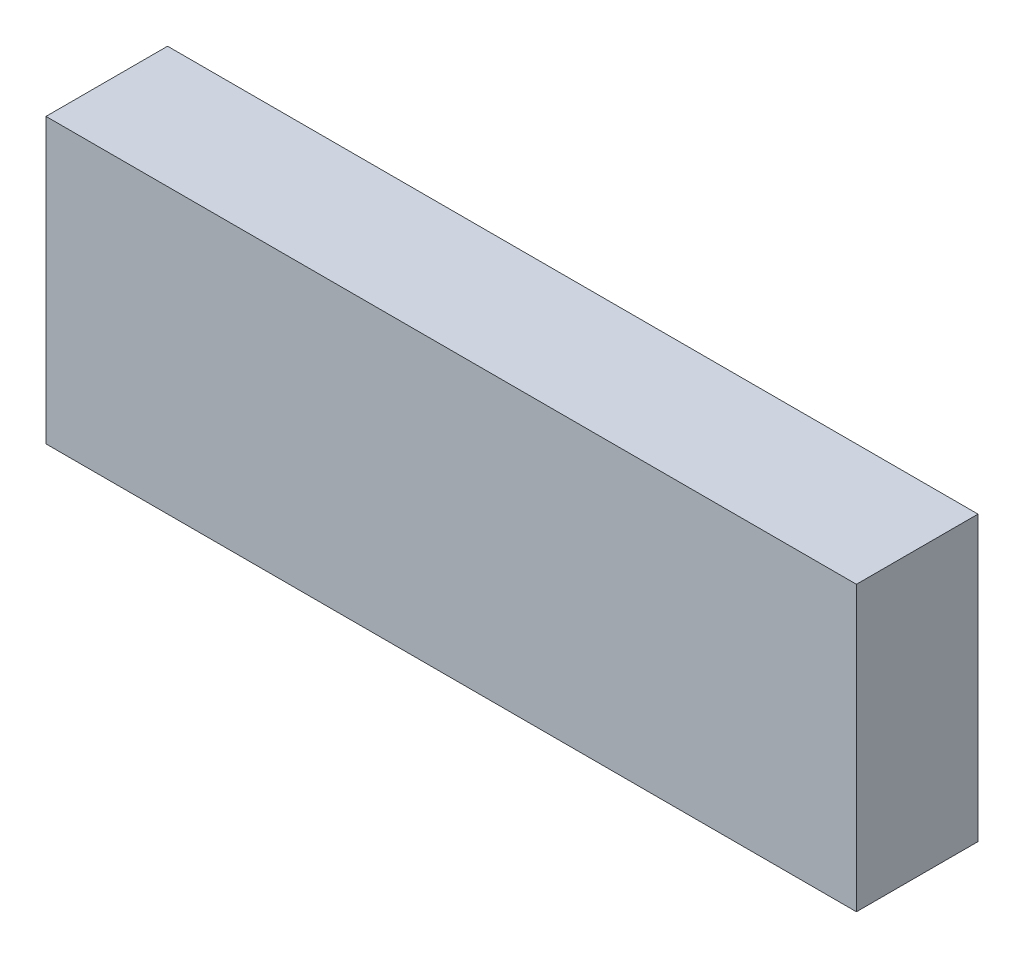
ISO-10303-21;
HEADER;
FILE_DESCRIPTION(('STEP AP214'),'2;1');
FILE_NAME('part.step','',(''),(''),'','','');
FILE_SCHEMA(('AUTOMOTIVE_DESIGN { 1 0 10303 214 1 1 1 1 }'));
ENDSEC;
DATA;
#1=APPLICATION_CONTEXT('core data for automotive mechanical design processes');
#2=APPLICATION_PROTOCOL_DEFINITION('international standard','automotive_design',2000,#1);
#3=PRODUCT_CONTEXT('',#1,'mechanical');
#4=PRODUCT('Part','Part','',(#3));
#5=PRODUCT_RELATED_PRODUCT_CATEGORY('part','',(#4));
#6=PRODUCT_DEFINITION_FORMATION('','',#4);
#7=PRODUCT_DEFINITION_CONTEXT('part definition',#1,'design');
#8=PRODUCT_DEFINITION('design','',#6,#7);
#9=PRODUCT_DEFINITION_SHAPE('','',#8);
#10=(LENGTH_UNIT() NAMED_UNIT(*) SI_UNIT(.MILLI.,.METRE.));
#11=(NAMED_UNIT(*) PLANE_ANGLE_UNIT() SI_UNIT($,.RADIAN.));
#12=(NAMED_UNIT(*) SI_UNIT($,.STERADIAN.) SOLID_ANGLE_UNIT());
#13=UNCERTAINTY_MEASURE_WITH_UNIT(LENGTH_MEASURE(1.E-05),#10,'distance_accuracy_value','');
#14=(GEOMETRIC_REPRESENTATION_CONTEXT(3) GLOBAL_UNCERTAINTY_ASSIGNED_CONTEXT((#13)) GLOBAL_UNIT_ASSIGNED_CONTEXT((#10,
#11,#12)) REPRESENTATION_CONTEXT('',''));
#15=CARTESIAN_POINT('',(0.,0.,0.));
#16=DIRECTION('',(0.,0.,1.));
#17=DIRECTION('',(1.,0.,0.));
#18=AXIS2_PLACEMENT_3D('',#15,#16,#17);
#19=CARTESIAN_POINT('',(254.,-44.45,-19.05));
#20=DIRECTION('',(0.,0.,1.));
#21=DIRECTION('',(1.,0.,0.));
#22=AXIS2_PLACEMENT_3D('',#19,#20,#21);
#23=PLANE('',#22);
#24=DIRECTION('',(0.,1.,0.));
#25=VECTOR('',#24,1.);
#26=CARTESIAN_POINT('',(0.,-44.45,-19.05));
#27=LINE('',#26,#25);
#28=CARTESIAN_POINT('',(0.,-44.45,-19.05));
#29=VERTEX_POINT('',#28);
#30=CARTESIAN_POINT('',(0.,44.45,-19.05));
#31=VERTEX_POINT('',#30);
#32=EDGE_CURVE('E95',#29,#31,#27,.T.);
#33=ORIENTED_EDGE('',*,*,#32,.T.);
#34=DIRECTION('',(-1.,0.,0.));
#35=VECTOR('',#34,1.);
#36=CARTESIAN_POINT('',(254.,44.45,-19.05));
#37=LINE('',#36,#35);
#38=CARTESIAN_POINT('',(254.,44.45,-19.05));
#39=VERTEX_POINT('',#38);
#40=EDGE_CURVE('E11',#39,#31,#37,.T.);
#41=ORIENTED_EDGE('',*,*,#40,.F.);
#42=DIRECTION('',(0.,1.,0.));
#43=VECTOR('',#42,1.);
#44=CARTESIAN_POINT('',(254.,-44.45,-19.05));
#45=LINE('',#44,#43);
#46=CARTESIAN_POINT('',(254.,-44.45,-19.05));
#47=VERTEX_POINT('',#46);
#48=EDGE_CURVE('E83',#47,#39,#45,.T.);
#49=ORIENTED_EDGE('',*,*,#48,.F.);
#50=DIRECTION('',(-1.,0.,0.));
#51=VECTOR('',#50,1.);
#52=CARTESIAN_POINT('',(254.,-44.45,-19.05));
#53=LINE('',#52,#51);
#54=EDGE_CURVE('E91',#47,#29,#53,.T.);
#55=ORIENTED_EDGE('',*,*,#54,.T.);
#56=EDGE_LOOP('',(#33,#41,#49,#55));
#57=FACE_BOUND('',#56,.T.);
#58=ADVANCED_FACE('F32',(#57),#23,.F.);
#59=CARTESIAN_POINT('',(254.,44.45,19.05));
#60=DIRECTION('',(0.,-1.,0.));
#61=DIRECTION('',(0.,0.,-1.));
#62=AXIS2_PLACEMENT_3D('',#59,#60,#61);
#63=PLANE('',#62);
#64=DIRECTION('',(0.,0.,1.));
#65=VECTOR('',#64,1.);
#66=CARTESIAN_POINT('',(0.,44.45,19.05));
#67=LINE('',#66,#65);
#68=CARTESIAN_POINT('',(0.,44.45,19.05));
#69=VERTEX_POINT('',#68);
#70=EDGE_CURVE('E87',#31,#69,#67,.T.);
#71=ORIENTED_EDGE('',*,*,#70,.T.);
#72=DIRECTION('',(-1.,0.,0.));
#73=VECTOR('',#72,1.);
#74=CARTESIAN_POINT('',(254.,44.45,19.05));
#75=LINE('',#74,#73);
#76=CARTESIAN_POINT('',(254.,44.45,19.05));
#77=VERTEX_POINT('',#76);
#78=EDGE_CURVE('E40',#77,#69,#75,.T.);
#79=ORIENTED_EDGE('',*,*,#78,.F.);
#80=DIRECTION('',(0.,0.,1.));
#81=VECTOR('',#80,1.);
#82=CARTESIAN_POINT('',(254.,44.45,19.05));
#83=LINE('',#82,#81);
#84=EDGE_CURVE('E78',#39,#77,#83,.T.);
#85=ORIENTED_EDGE('',*,*,#84,.F.);
#86=ORIENTED_EDGE('',*,*,#40,.T.);
#87=EDGE_LOOP('',(#71,#79,#85,#86));
#88=FACE_BOUND('',#87,.T.);
#89=ADVANCED_FACE('F86',(#88),#63,.F.);
#90=CARTESIAN_POINT('',(254.,-44.45,19.05));
#91=DIRECTION('',(0.,0.,-1.));
#92=DIRECTION('',(-1.,0.,0.));
#93=AXIS2_PLACEMENT_3D('',#90,#91,#92);
#94=PLANE('',#93);
#95=DIRECTION('',(0.,-1.,0.));
#96=VECTOR('',#95,1.);
#97=CARTESIAN_POINT('',(0.,-44.45,19.05));
#98=LINE('',#97,#96);
#99=CARTESIAN_POINT('',(0.,-44.45,19.05));
#100=VERTEX_POINT('',#99);
#101=EDGE_CURVE('E65',#69,#100,#98,.T.);
#102=ORIENTED_EDGE('',*,*,#101,.T.);
#103=DIRECTION('',(-1.,0.,0.));
#104=VECTOR('',#103,1.);
#105=CARTESIAN_POINT('',(254.,-44.45,19.05));
#106=LINE('',#105,#104);
#107=CARTESIAN_POINT('',(254.,-44.45,19.05));
#108=VERTEX_POINT('',#107);
#109=EDGE_CURVE('E88',#108,#100,#106,.T.);
#110=ORIENTED_EDGE('',*,*,#109,.F.);
#111=DIRECTION('',(0.,-1.,0.));
#112=VECTOR('',#111,1.);
#113=CARTESIAN_POINT('',(254.,-44.45,19.05));
#114=LINE('',#113,#112);
#115=EDGE_CURVE('E81',#77,#108,#114,.T.);
#116=ORIENTED_EDGE('',*,*,#115,.F.);
#117=ORIENTED_EDGE('',*,*,#78,.T.);
#118=EDGE_LOOP('',(#102,#110,#116,#117));
#119=FACE_BOUND('',#118,.T.);
#120=ADVANCED_FACE('F89',(#119),#94,.F.);
#121=CARTESIAN_POINT('',(254.,-44.45,19.05));
#122=DIRECTION('',(0.,1.,0.));
#123=DIRECTION('',(0.,0.,1.));
#124=AXIS2_PLACEMENT_3D('',#121,#122,#123);
#125=PLANE('',#124);
#126=DIRECTION('',(0.,0.,-1.));
#127=VECTOR('',#126,1.);
#128=CARTESIAN_POINT('',(0.,-44.45,19.05));
#129=LINE('',#128,#127);
#130=EDGE_CURVE('E71',#100,#29,#129,.T.);
#131=ORIENTED_EDGE('',*,*,#130,.T.);
#132=ORIENTED_EDGE('',*,*,#54,.F.);
#133=DIRECTION('',(0.,0.,-1.));
#134=VECTOR('',#133,1.);
#135=CARTESIAN_POINT('',(254.,-44.45,19.05));
#136=LINE('',#135,#134);
#137=EDGE_CURVE('E48',#108,#47,#136,.T.);
#138=ORIENTED_EDGE('',*,*,#137,.F.);
#139=ORIENTED_EDGE('',*,*,#109,.T.);
#140=EDGE_LOOP('',(#131,#132,#138,#139));
#141=FACE_BOUND('',#140,.T.);
#142=ADVANCED_FACE('F102',(#141),#125,.F.);
#143=CARTESIAN_POINT('',(254.,0.,0.));
#144=DIRECTION('',(-1.,0.,0.));
#145=DIRECTION('',(0.,0.,1.));
#146=AXIS2_PLACEMENT_3D('',#143,#144,#145);
#147=PLANE('',#146);
#148=ORIENTED_EDGE('',*,*,#48,.T.);
#149=ORIENTED_EDGE('',*,*,#84,.T.);
#150=ORIENTED_EDGE('',*,*,#115,.T.);
#151=ORIENTED_EDGE('',*,*,#137,.T.);
#152=EDGE_LOOP('',(#148,#149,#150,#151));
#153=FACE_BOUND('',#152,.T.);
#154=ADVANCED_FACE('F79',(#153),#147,.F.);
#155=CARTESIAN_POINT('',(0.,0.,0.));
#156=DIRECTION('',(-1.,0.,0.));
#157=DIRECTION('',(0.,0.,1.));
#158=AXIS2_PLACEMENT_3D('',#155,#156,#157);
#159=PLANE('',#158);
#160=ORIENTED_EDGE('',*,*,#32,.F.);
#161=ORIENTED_EDGE('',*,*,#130,.F.);
#162=ORIENTED_EDGE('',*,*,#101,.F.);
#163=ORIENTED_EDGE('',*,*,#70,.F.);
#164=EDGE_LOOP('',(#160,#161,#162,#163));
#165=FACE_BOUND('',#164,.T.);
#166=ADVANCED_FACE('F105',(#165),#159,.T.);
#167=CLOSED_SHELL('',(#58,#89,#120,#142,#154,#166));
#168=MANIFOLD_SOLID_BREP('B2',#167);
#169=ADVANCED_BREP_SHAPE_REPRESENTATION('',(#18,#168),#14);
#170=SHAPE_DEFINITION_REPRESENTATION(#9,#169);
ENDSEC;
END-ISO-10303-21;
